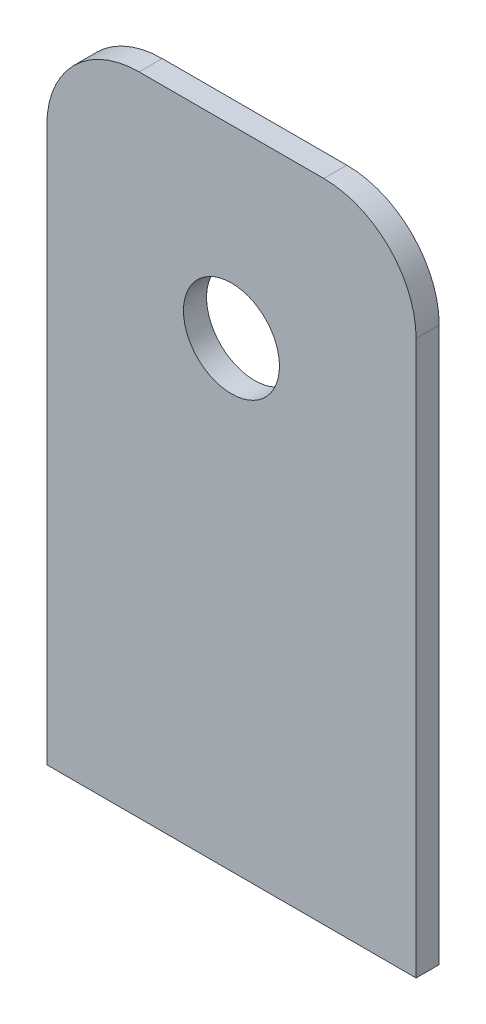
ISO-10303-21;
HEADER;
FILE_DESCRIPTION(('STEP AP214'),'2;1');
FILE_NAME('part.step','',(''),(''),'','','');
FILE_SCHEMA(('AUTOMOTIVE_DESIGN { 1 0 10303 214 1 1 1 1 }'));
ENDSEC;
DATA;
#1=APPLICATION_CONTEXT('core data for automotive mechanical design processes');
#2=APPLICATION_PROTOCOL_DEFINITION('international standard','automotive_design',2000,#1);
#3=PRODUCT_CONTEXT('',#1,'mechanical');
#4=PRODUCT('Part','Part','',(#3));
#5=PRODUCT_RELATED_PRODUCT_CATEGORY('part','',(#4));
#6=PRODUCT_DEFINITION_FORMATION('','',#4);
#7=PRODUCT_DEFINITION_CONTEXT('part definition',#1,'design');
#8=PRODUCT_DEFINITION('design','',#6,#7);
#9=PRODUCT_DEFINITION_SHAPE('','',#8);
#10=(LENGTH_UNIT() NAMED_UNIT(*) SI_UNIT(.MILLI.,.METRE.));
#11=(NAMED_UNIT(*) PLANE_ANGLE_UNIT() SI_UNIT($,.RADIAN.));
#12=(NAMED_UNIT(*) SI_UNIT($,.STERADIAN.) SOLID_ANGLE_UNIT());
#13=UNCERTAINTY_MEASURE_WITH_UNIT(LENGTH_MEASURE(1.E-05),#10,'distance_accuracy_value','');
#14=(GEOMETRIC_REPRESENTATION_CONTEXT(3) GLOBAL_UNCERTAINTY_ASSIGNED_CONTEXT((#13)) GLOBAL_UNIT_ASSIGNED_CONTEXT((#10,
#11,#12)) REPRESENTATION_CONTEXT('',''));
#15=CARTESIAN_POINT('',(0.,0.,0.));
#16=DIRECTION('',(0.,0.,1.));
#17=DIRECTION('',(1.,0.,0.));
#18=AXIS2_PLACEMENT_3D('',#15,#16,#17);
#19=CARTESIAN_POINT('',(-12.7,0.,1.5875));
#20=DIRECTION('',(1.,0.,0.));
#21=DIRECTION('',(0.,0.,-1.));
#22=AXIS2_PLACEMENT_3D('',#19,#20,#21);
#23=PLANE('',#22);
#24=DIRECTION('',(0.,-1.,0.));
#25=VECTOR('',#24,1.);
#26=CARTESIAN_POINT('',(-12.7,0.,1.5875));
#27=LINE('',#26,#25);
#28=CARTESIAN_POINT('',(-12.7,25.4,1.5875));
#29=VERTEX_POINT('',#28);
#30=CARTESIAN_POINT('',(-12.7,-12.7,1.58750000000001));
#31=VERTEX_POINT('',#30);
#32=EDGE_CURVE('E137',#29,#31,#27,.T.);
#33=ORIENTED_EDGE('',*,*,#32,.F.);
#34=DIRECTION('',(0.,0.,-1.));
#35=VECTOR('',#34,1.);
#36=CARTESIAN_POINT('',(-12.7,25.4,1.5875));
#37=LINE('',#36,#35);
#38=CARTESIAN_POINT('',(-12.7,25.4,0.));
#39=VERTEX_POINT('',#38);
#40=EDGE_CURVE('E12',#29,#39,#37,.T.);
#41=ORIENTED_EDGE('',*,*,#40,.T.);
#42=DIRECTION('',(0.,-1.,0.));
#43=VECTOR('',#42,1.);
#44=CARTESIAN_POINT('',(-12.7,0.,0.));
#45=LINE('',#44,#43);
#46=CARTESIAN_POINT('',(-12.7,-12.7,0.));
#47=VERTEX_POINT('',#46);
#48=EDGE_CURVE('E105',#39,#47,#45,.T.);
#49=ORIENTED_EDGE('',*,*,#48,.T.);
#50=DIRECTION('',(0.,0.,-1.));
#51=VECTOR('',#50,1.);
#52=CARTESIAN_POINT('',(-12.7,-12.7,29.9855633142473));
#53=LINE('',#52,#51);
#54=EDGE_CURVE('E114',#31,#47,#53,.T.);
#55=ORIENTED_EDGE('',*,*,#54,.F.);
#56=EDGE_LOOP('',(#33,#41,#49,#55));
#57=FACE_BOUND('',#56,.T.);
#58=ADVANCED_FACE('F42',(#57),#23,.F.);
#59=CARTESIAN_POINT('',(12.7,0.,1.5875));
#60=DIRECTION('',(-1.,0.,0.));
#61=DIRECTION('',(0.,0.,1.));
#62=AXIS2_PLACEMENT_3D('',#59,#60,#61);
#63=PLANE('',#62);
#64=DIRECTION('',(0.,1.,0.));
#65=VECTOR('',#64,1.);
#66=CARTESIAN_POINT('',(12.7,0.,0.));
#67=LINE('',#66,#65);
#68=CARTESIAN_POINT('',(12.7,-12.7,0.));
#69=VERTEX_POINT('',#68);
#70=CARTESIAN_POINT('',(12.7,25.4,0.));
#71=VERTEX_POINT('',#70);
#72=EDGE_CURVE('E96',#69,#71,#67,.T.);
#73=ORIENTED_EDGE('',*,*,#72,.T.);
#74=DIRECTION('',(0.,0.,-1.));
#75=VECTOR('',#74,1.);
#76=CARTESIAN_POINT('',(12.7,25.4,1.5875));
#77=LINE('',#76,#75);
#78=CARTESIAN_POINT('',(12.7,25.4,1.5875));
#79=VERTEX_POINT('',#78);
#80=EDGE_CURVE('E65',#71,#79,#77,.F.);
#81=ORIENTED_EDGE('',*,*,#80,.T.);
#82=DIRECTION('',(0.,1.,0.));
#83=VECTOR('',#82,1.);
#84=CARTESIAN_POINT('',(12.7,0.,1.5875));
#85=LINE('',#84,#83);
#86=CARTESIAN_POINT('',(12.7,-12.7,1.5875));
#87=VERTEX_POINT('',#86);
#88=EDGE_CURVE('E110',#87,#79,#85,.T.);
#89=ORIENTED_EDGE('',*,*,#88,.F.);
#90=DIRECTION('',(0.,0.,-1.));
#91=VECTOR('',#90,1.);
#92=CARTESIAN_POINT('',(12.7,-12.7,29.9855633142473));
#93=LINE('',#92,#91);
#94=EDGE_CURVE('E108',#87,#69,#93,.T.);
#95=ORIENTED_EDGE('',*,*,#94,.T.);
#96=EDGE_LOOP('',(#73,#81,#89,#95));
#97=FACE_BOUND('',#96,.T.);
#98=ADVANCED_FACE('F109',(#97),#63,.F.);
#99=CARTESIAN_POINT('',(-12.7,31.75,1.5875));
#100=DIRECTION('',(0.,-1.,0.));
#101=DIRECTION('',(0.,0.,-1.));
#102=AXIS2_PLACEMENT_3D('',#99,#100,#101);
#103=PLANE('',#102);
#104=DIRECTION('',(-1.,0.,0.));
#105=VECTOR('',#104,1.);
#106=CARTESIAN_POINT('',(-12.7,31.75,1.5875));
#107=LINE('',#106,#105);
#108=CARTESIAN_POINT('',(6.35,31.75,1.5875));
#109=VERTEX_POINT('',#108);
#110=CARTESIAN_POINT('',(-6.35,31.75,1.5875));
#111=VERTEX_POINT('',#110);
#112=EDGE_CURVE('E129',#109,#111,#107,.T.);
#113=ORIENTED_EDGE('',*,*,#112,.F.);
#114=DIRECTION('',(0.,0.,-1.));
#115=VECTOR('',#114,1.);
#116=CARTESIAN_POINT('',(6.35,31.75,1.5875));
#117=LINE('',#116,#115);
#118=CARTESIAN_POINT('',(6.35,31.75,0.));
#119=VERTEX_POINT('',#118);
#120=EDGE_CURVE('E158',#109,#119,#117,.T.);
#121=ORIENTED_EDGE('',*,*,#120,.T.);
#122=DIRECTION('',(-1.,0.,0.));
#123=VECTOR('',#122,1.);
#124=CARTESIAN_POINT('',(-12.7,31.75,0.));
#125=LINE('',#124,#123);
#126=CARTESIAN_POINT('',(-6.35,31.75,0.));
#127=VERTEX_POINT('',#126);
#128=EDGE_CURVE('E104',#119,#127,#125,.T.);
#129=ORIENTED_EDGE('',*,*,#128,.T.);
#130=DIRECTION('',(0.,0.,-1.));
#131=VECTOR('',#130,1.);
#132=CARTESIAN_POINT('',(-6.35,31.75,1.5875));
#133=LINE('',#132,#131);
#134=EDGE_CURVE('E138',#127,#111,#133,.F.);
#135=ORIENTED_EDGE('',*,*,#134,.T.);
#136=EDGE_LOOP('',(#113,#121,#129,#135));
#137=FACE_BOUND('',#136,.T.);
#138=ADVANCED_FACE('F157',(#137),#103,.F.);
#139=CARTESIAN_POINT('',(0.,0.,1.5875));
#140=DIRECTION('',(0.,0.,-1.));
#141=DIRECTION('',(-1.,0.,0.));
#142=AXIS2_PLACEMENT_3D('',#139,#140,#141);
#143=PLANE('',#142);
#144=CARTESIAN_POINT('',(0.,19.05,1.5875));
#145=DIRECTION('',(0.,0.,-1.));
#146=DIRECTION('',(-1.,0.,0.));
#147=AXIS2_PLACEMENT_3D('',#144,#145,#146);
#148=CIRCLE('',#147,3.302);
#149=CARTESIAN_POINT('',(-3.302,19.05,1.5875));
#150=VERTEX_POINT('',#149);
#151=EDGE_CURVE('E128',#150,#150,#148,.T.);
#152=ORIENTED_EDGE('',*,*,#151,.T.);
#153=EDGE_LOOP('',(#152));
#154=FACE_BOUND('',#153,.T.);
#155=ORIENTED_EDGE('',*,*,#88,.T.);
#156=CARTESIAN_POINT('',(6.35,25.4,1.5875));
#157=DIRECTION('',(0.,0.,-1.));
#158=DIRECTION('',(-1.,0.,0.));
#159=AXIS2_PLACEMENT_3D('',#156,#157,#158);
#160=CIRCLE('',#159,6.35);
#161=EDGE_CURVE('E50',#79,#109,#160,.F.);
#162=ORIENTED_EDGE('',*,*,#161,.T.);
#163=ORIENTED_EDGE('',*,*,#112,.T.);
#164=CARTESIAN_POINT('',(-6.35,25.4,1.5875));
#165=DIRECTION('',(0.,0.,-1.));
#166=DIRECTION('',(-1.,0.,0.));
#167=AXIS2_PLACEMENT_3D('',#164,#165,#166);
#168=CIRCLE('',#167,6.35);
#169=EDGE_CURVE('E57',#111,#29,#168,.F.);
#170=ORIENTED_EDGE('',*,*,#169,.T.);
#171=ORIENTED_EDGE('',*,*,#32,.T.);
#172=DIRECTION('',(1.,0.,0.));
#173=VECTOR('',#172,1.);
#174=CARTESIAN_POINT('',(12.7,-12.7,1.5875));
#175=LINE('',#174,#173);
#176=EDGE_CURVE('E173',#31,#87,#175,.T.);
#177=ORIENTED_EDGE('',*,*,#176,.T.);
#178=EDGE_LOOP('',(#155,#162,#163,#170,#171,#177));
#179=FACE_BOUND('',#178,.T.);
#180=ADVANCED_FACE('F152',(#154,#179),#143,.F.);
#181=CARTESIAN_POINT('',(0.,0.,0.));
#182=DIRECTION('',(0.,0.,-1.));
#183=DIRECTION('',(-1.,0.,0.));
#184=AXIS2_PLACEMENT_3D('',#181,#182,#183);
#185=PLANE('',#184);
#186=CARTESIAN_POINT('',(0.,19.05,0.));
#187=DIRECTION('',(0.,0.,1.));
#188=DIRECTION('',(1.,0.,0.));
#189=AXIS2_PLACEMENT_3D('',#186,#187,#188);
#190=CIRCLE('',#189,3.302);
#191=CARTESIAN_POINT('',(3.302,19.05,0.));
#192=VERTEX_POINT('',#191);
#193=EDGE_CURVE('E175',#192,#192,#190,.T.);
#194=ORIENTED_EDGE('',*,*,#193,.T.);
#195=EDGE_LOOP('',(#194));
#196=FACE_BOUND('',#195,.T.);
#197=ORIENTED_EDGE('',*,*,#128,.F.);
#198=CARTESIAN_POINT('',(6.35,25.4,0.));
#199=DIRECTION('',(0.,0.,-1.));
#200=DIRECTION('',(-1.,0.,0.));
#201=AXIS2_PLACEMENT_3D('',#198,#199,#200);
#202=CIRCLE('',#201,6.35);
#203=EDGE_CURVE('E103',#119,#71,#202,.T.);
#204=ORIENTED_EDGE('',*,*,#203,.T.);
#205=ORIENTED_EDGE('',*,*,#72,.F.);
#206=DIRECTION('',(-1.,0.,0.));
#207=VECTOR('',#206,1.);
#208=CARTESIAN_POINT('',(12.7,-12.7,0.));
#209=LINE('',#208,#207);
#210=EDGE_CURVE('E102',#69,#47,#209,.T.);
#211=ORIENTED_EDGE('',*,*,#210,.T.);
#212=ORIENTED_EDGE('',*,*,#48,.F.);
#213=CARTESIAN_POINT('',(-6.35,25.4,0.));
#214=DIRECTION('',(0.,0.,-1.));
#215=DIRECTION('',(-1.,0.,0.));
#216=AXIS2_PLACEMENT_3D('',#213,#214,#215);
#217=CIRCLE('',#216,6.35);
#218=EDGE_CURVE('E147',#39,#127,#217,.T.);
#219=ORIENTED_EDGE('',*,*,#218,.T.);
#220=EDGE_LOOP('',(#197,#204,#205,#211,#212,#219));
#221=FACE_BOUND('',#220,.T.);
#222=ADVANCED_FACE('F99',(#196,#221),#185,.T.);
#223=CARTESIAN_POINT('',(0.,19.05,0.));
#224=DIRECTION('',(0.,0.,1.));
#225=DIRECTION('',(1.,0.,0.));
#226=AXIS2_PLACEMENT_3D('',#223,#224,#225);
#227=CYLINDRICAL_SURFACE('',#226,3.302);
#228=ORIENTED_EDGE('',*,*,#193,.F.);
#229=EDGE_LOOP('',(#228));
#230=FACE_BOUND('',#229,.T.);
#231=ORIENTED_EDGE('',*,*,#151,.F.);
#232=EDGE_LOOP('',(#231));
#233=FACE_BOUND('',#232,.T.);
#234=ADVANCED_FACE('F184',(#230,#233),#227,.F.);
#235=CARTESIAN_POINT('',(6.35,25.4,1.5875));
#236=DIRECTION('',(0.,0.,-1.));
#237=DIRECTION('',(-1.,0.,0.));
#238=AXIS2_PLACEMENT_3D('',#235,#236,#237);
#239=CYLINDRICAL_SURFACE('',#238,6.35);
#240=ORIENTED_EDGE('',*,*,#161,.F.);
#241=ORIENTED_EDGE('',*,*,#80,.F.);
#242=ORIENTED_EDGE('',*,*,#203,.F.);
#243=ORIENTED_EDGE('',*,*,#120,.F.);
#244=EDGE_LOOP('',(#240,#241,#242,#243));
#245=FACE_BOUND('',#244,.T.);
#246=ADVANCED_FACE('F160',(#245),#239,.T.);
#247=CARTESIAN_POINT('',(-6.35,25.4,1.5875));
#248=DIRECTION('',(0.,0.,-1.));
#249=DIRECTION('',(-1.,0.,0.));
#250=AXIS2_PLACEMENT_3D('',#247,#248,#249);
#251=CYLINDRICAL_SURFACE('',#250,6.35);
#252=ORIENTED_EDGE('',*,*,#169,.F.);
#253=ORIENTED_EDGE('',*,*,#134,.F.);
#254=ORIENTED_EDGE('',*,*,#218,.F.);
#255=ORIENTED_EDGE('',*,*,#40,.F.);
#256=EDGE_LOOP('',(#252,#253,#254,#255));
#257=FACE_BOUND('',#256,.T.);
#258=ADVANCED_FACE('F44',(#257),#251,.T.);
#259=CARTESIAN_POINT('',(12.7,-12.7,29.9855633142473));
#260=DIRECTION('',(0.,-1.,0.));
#261=DIRECTION('',(0.,0.,-1.));
#262=AXIS2_PLACEMENT_3D('',#259,#260,#261);
#263=PLANE('',#262);
#264=ORIENTED_EDGE('',*,*,#176,.F.);
#265=ORIENTED_EDGE('',*,*,#54,.T.);
#266=ORIENTED_EDGE('',*,*,#210,.F.);
#267=ORIENTED_EDGE('',*,*,#94,.F.);
#268=EDGE_LOOP('',(#264,#265,#266,#267));
#269=FACE_BOUND('',#268,.T.);
#270=ADVANCED_FACE('F117',(#269),#263,.T.);
#271=CLOSED_SHELL('',(#58,#98,#138,#180,#222,#234,#246,#258,#270));
#272=MANIFOLD_SOLID_BREP('B2',#271);
#273=ADVANCED_BREP_SHAPE_REPRESENTATION('',(#18,#272),#14);
#274=SHAPE_DEFINITION_REPRESENTATION(#9,#273);
ENDSEC;
END-ISO-10303-21;
